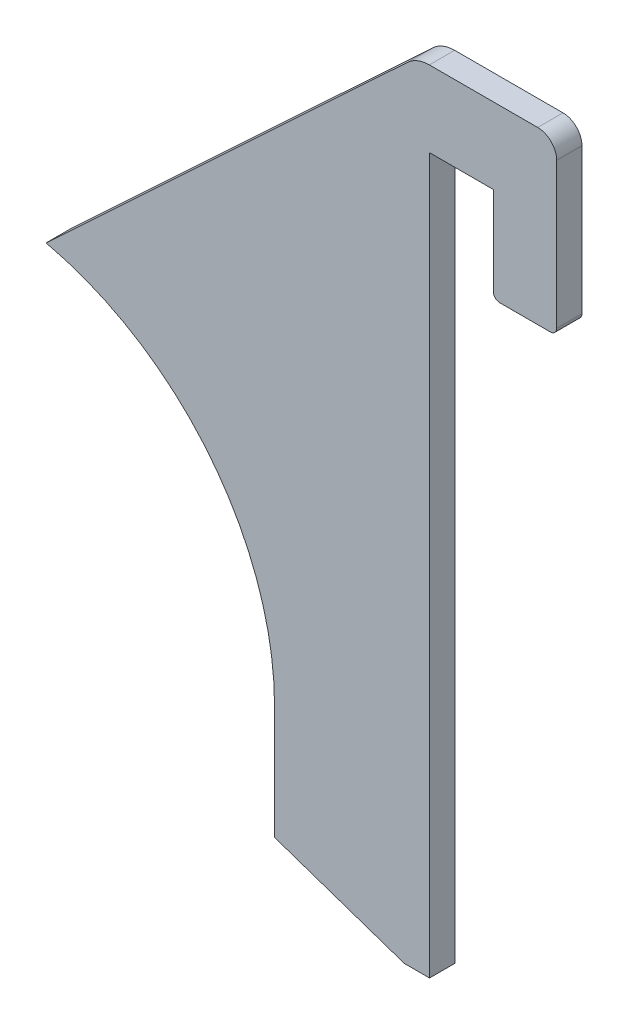
ISO-10303-21;
HEADER;
FILE_DESCRIPTION(('STEP AP214'),'2;1');
FILE_NAME('part.step','',(''),(''),'','','');
FILE_SCHEMA(('AUTOMOTIVE_DESIGN { 1 0 10303 214 1 1 1 1 }'));
ENDSEC;
DATA;
#1=APPLICATION_CONTEXT('core data for automotive mechanical design processes');
#2=APPLICATION_PROTOCOL_DEFINITION('international standard','automotive_design',2000,#1);
#3=PRODUCT_CONTEXT('',#1,'mechanical');
#4=PRODUCT('Part','Part','',(#3));
#5=PRODUCT_RELATED_PRODUCT_CATEGORY('part','',(#4));
#6=PRODUCT_DEFINITION_FORMATION('','',#4);
#7=PRODUCT_DEFINITION_CONTEXT('part definition',#1,'design');
#8=PRODUCT_DEFINITION('design','',#6,#7);
#9=PRODUCT_DEFINITION_SHAPE('','',#8);
#10=(LENGTH_UNIT() NAMED_UNIT(*) SI_UNIT(.MILLI.,.METRE.));
#11=(NAMED_UNIT(*) PLANE_ANGLE_UNIT() SI_UNIT($,.RADIAN.));
#12=(NAMED_UNIT(*) SI_UNIT($,.STERADIAN.) SOLID_ANGLE_UNIT());
#13=UNCERTAINTY_MEASURE_WITH_UNIT(LENGTH_MEASURE(1.E-05),#10,'distance_accuracy_value','');
#14=(GEOMETRIC_REPRESENTATION_CONTEXT(3) GLOBAL_UNCERTAINTY_ASSIGNED_CONTEXT((#13)) GLOBAL_UNIT_ASSIGNED_CONTEXT((#10,
#11,#12)) REPRESENTATION_CONTEXT('',''));
#15=CARTESIAN_POINT('',(0.,0.,0.));
#16=DIRECTION('',(0.,0.,1.));
#17=DIRECTION('',(1.,0.,0.));
#18=AXIS2_PLACEMENT_3D('',#15,#16,#17);
#19=CARTESIAN_POINT('',(69.,100.,4.));
#20=DIRECTION('',(0.681998360062503,-0.731353701619167,0.));
#21=DIRECTION('',(0.731353701619167,0.681998360062503,0.));
#22=AXIS2_PLACEMENT_3D('',#19,#20,#21);
#23=PLANE('',#22);
#24=DIRECTION('',(-0.731353701619166,-0.681998360062503,0.));
#25=VECTOR('',#24,1.);
#26=CARTESIAN_POINT('',(69.,100.,4.));
#27=LINE('',#26,#25);
#28=CARTESIAN_POINT('',(67.5595605777622,98.6567685080958,4.));
#29=VERTEX_POINT('',#28);
#30=CARTESIAN_POINT('',(10.3719829262458,45.3284896083872,4.));
#31=VERTEX_POINT('',#30);
#32=EDGE_CURVE('E143',#29,#31,#27,.T.);
#33=ORIENTED_EDGE('',*,*,#32,.F.);
#34=DIRECTION('',(0.,0.,-1.));
#35=VECTOR('',#34,1.);
#36=CARTESIAN_POINT('',(67.5595605777622,98.6567685080958,4.));
#37=LINE('',#36,#35);
#38=CARTESIAN_POINT('',(67.5595605777622,98.6567685080958,0.));
#39=VERTEX_POINT('',#38);
#40=EDGE_CURVE('E12',#29,#39,#37,.T.);
#41=ORIENTED_EDGE('',*,*,#40,.T.);
#42=DIRECTION('',(-0.731353701619166,-0.681998360062503,0.));
#43=VECTOR('',#42,1.);
#44=CARTESIAN_POINT('',(69.,100.,0.));
#45=LINE('',#44,#43);
#46=CARTESIAN_POINT('',(10.3719829262458,45.3284896083872,0.));
#47=VERTEX_POINT('',#46);
#48=EDGE_CURVE('E166',#39,#47,#45,.T.);
#49=ORIENTED_EDGE('',*,*,#48,.T.);
#50=DIRECTION('',(0.,0.,-1.));
#51=VECTOR('',#50,1.);
#52=CARTESIAN_POINT('',(10.3719829262458,45.3284896083872,4.));
#53=LINE('',#52,#51);
#54=EDGE_CURVE('E159',#31,#47,#53,.T.);
#55=ORIENTED_EDGE('',*,*,#54,.F.);
#56=EDGE_LOOP('',(#33,#41,#49,#55));
#57=FACE_BOUND('',#56,.T.);
#58=ADVANCED_FACE('F36',(#57),#23,.F.);
#59=CARTESIAN_POINT('',(0.,0.,4.));
#60=DIRECTION('',(0.,0.,-1.));
#61=DIRECTION('',(-1.,0.,0.));
#62=AXIS2_PLACEMENT_3D('',#59,#60,#61);
#63=CYLINDRICAL_SURFACE('',#62,46.5);
#64=CARTESIAN_POINT('',(0.,0.,0.));
#65=DIRECTION('',(0.,0.,-1.));
#66=DIRECTION('',(-1.,0.,0.));
#67=AXIS2_PLACEMENT_3D('',#64,#65,#66);
#68=CIRCLE('',#67,46.5);
#69=CARTESIAN_POINT('',(46.5,0.,0.));
#70=VERTEX_POINT('',#69);
#71=EDGE_CURVE('E240',#47,#70,#68,.T.);
#72=ORIENTED_EDGE('',*,*,#71,.T.);
#73=DIRECTION('',(0.,0.,-1.));
#74=VECTOR('',#73,1.);
#75=CARTESIAN_POINT('',(46.5,0.,4.));
#76=LINE('',#75,#74);
#77=CARTESIAN_POINT('',(46.5,0.,4.));
#78=VERTEX_POINT('',#77);
#79=EDGE_CURVE('E161',#78,#70,#76,.T.);
#80=ORIENTED_EDGE('',*,*,#79,.F.);
#81=CARTESIAN_POINT('',(0.,0.,4.));
#82=DIRECTION('',(0.,0.,-1.));
#83=DIRECTION('',(-1.,0.,0.));
#84=AXIS2_PLACEMENT_3D('',#81,#82,#83);
#85=CIRCLE('',#84,46.5);
#86=EDGE_CURVE('E147',#31,#78,#85,.T.);
#87=ORIENTED_EDGE('',*,*,#86,.F.);
#88=ORIENTED_EDGE('',*,*,#54,.T.);
#89=EDGE_LOOP('',(#72,#80,#87,#88));
#90=FACE_BOUND('',#89,.T.);
#91=ADVANCED_FACE('F158',(#90),#63,.F.);
#92=CARTESIAN_POINT('',(46.5,0.,4.));
#93=DIRECTION('',(1.,0.,0.));
#94=DIRECTION('',(0.,1.,0.));
#95=AXIS2_PLACEMENT_3D('',#92,#93,#94);
#96=PLANE('',#95);
#97=DIRECTION('',(0.,-1.,0.));
#98=VECTOR('',#97,1.);
#99=CARTESIAN_POINT('',(46.5,0.,0.));
#100=LINE('',#99,#98);
#101=CARTESIAN_POINT('',(46.5,-18.,0.));
#102=VERTEX_POINT('',#101);
#103=EDGE_CURVE('E238',#70,#102,#100,.T.);
#104=ORIENTED_EDGE('',*,*,#103,.T.);
#105=DIRECTION('',(0.,0.,-1.));
#106=VECTOR('',#105,1.);
#107=CARTESIAN_POINT('',(46.5,-18.,4.));
#108=LINE('',#107,#106);
#109=CARTESIAN_POINT('',(46.5,-18.,4.));
#110=VERTEX_POINT('',#109);
#111=EDGE_CURVE('E172',#110,#102,#108,.T.);
#112=ORIENTED_EDGE('',*,*,#111,.F.);
#113=DIRECTION('',(0.,-1.,0.));
#114=VECTOR('',#113,1.);
#115=CARTESIAN_POINT('',(46.5,0.,4.));
#116=LINE('',#115,#114);
#117=EDGE_CURVE('E163',#78,#110,#116,.T.);
#118=ORIENTED_EDGE('',*,*,#117,.F.);
#119=ORIENTED_EDGE('',*,*,#79,.T.);
#120=EDGE_LOOP('',(#104,#112,#118,#119));
#121=FACE_BOUND('',#120,.T.);
#122=ADVANCED_FACE('F239',(#121),#96,.F.);
#123=CARTESIAN_POINT('',(67.,-25.,4.));
#124=DIRECTION('',(-0.323143853291512,-0.946349856067994,0.));
#125=DIRECTION('',(0.946349856067995,-0.323143853291512,0.));
#126=AXIS2_PLACEMENT_3D('',#123,#124,#125);
#127=PLANE('',#126);
#128=DIRECTION('',(-0.946349856067994,0.323143853291512,0.));
#129=VECTOR('',#128,1.);
#130=CARTESIAN_POINT('',(67.,-25.,0.));
#131=LINE('',#130,#129);
#132=CARTESIAN_POINT('',(67.,-25.,0.));
#133=VERTEX_POINT('',#132);
#134=EDGE_CURVE('E233',#133,#102,#131,.T.);
#135=ORIENTED_EDGE('',*,*,#134,.F.);
#136=DIRECTION('',(0.,0.,-1.));
#137=VECTOR('',#136,1.);
#138=CARTESIAN_POINT('',(67.,-25.,4.));
#139=LINE('',#138,#137);
#140=CARTESIAN_POINT('',(67.,-25.,4.));
#141=VERTEX_POINT('',#140);
#142=EDGE_CURVE('E225',#141,#133,#139,.T.);
#143=ORIENTED_EDGE('',*,*,#142,.F.);
#144=DIRECTION('',(-0.946349856067994,0.323143853291512,0.));
#145=VECTOR('',#144,1.);
#146=CARTESIAN_POINT('',(67.,-25.,4.));
#147=LINE('',#146,#145);
#148=EDGE_CURVE('E235',#141,#110,#147,.T.);
#149=ORIENTED_EDGE('',*,*,#148,.T.);
#150=ORIENTED_EDGE('',*,*,#111,.T.);
#151=EDGE_LOOP('',(#135,#143,#149,#150));
#152=FACE_BOUND('',#151,.T.);
#153=ADVANCED_FACE('F231',(#152),#127,.T.);
#154=CARTESIAN_POINT('',(67.,-25.,4.));
#155=DIRECTION('',(0.,1.,0.));
#156=DIRECTION('',(-1.,0.,0.));
#157=AXIS2_PLACEMENT_3D('',#154,#155,#156);
#158=PLANE('',#157);
#159=DIRECTION('',(1.,0.,0.));
#160=VECTOR('',#159,1.);
#161=CARTESIAN_POINT('',(67.,-25.,0.));
#162=LINE('',#161,#160);
#163=CARTESIAN_POINT('',(71.,-25.,0.));
#164=VERTEX_POINT('',#163);
#165=EDGE_CURVE('E244',#133,#164,#162,.T.);
#166=ORIENTED_EDGE('',*,*,#165,.T.);
#167=DIRECTION('',(0.,0.,-1.));
#168=VECTOR('',#167,1.);
#169=CARTESIAN_POINT('',(71.,-25.,4.));
#170=LINE('',#169,#168);
#171=CARTESIAN_POINT('',(71.,-25.,4.));
#172=VERTEX_POINT('',#171);
#173=EDGE_CURVE('E222',#172,#164,#170,.T.);
#174=ORIENTED_EDGE('',*,*,#173,.F.);
#175=DIRECTION('',(1.,0.,0.));
#176=VECTOR('',#175,1.);
#177=CARTESIAN_POINT('',(67.,-25.,4.));
#178=LINE('',#177,#176);
#179=EDGE_CURVE('E283',#141,#172,#178,.T.);
#180=ORIENTED_EDGE('',*,*,#179,.F.);
#181=ORIENTED_EDGE('',*,*,#142,.T.);
#182=EDGE_LOOP('',(#166,#174,#180,#181));
#183=FACE_BOUND('',#182,.T.);
#184=ADVANCED_FACE('F291',(#183),#158,.F.);
#185=CARTESIAN_POINT('',(71.,-25.,4.));
#186=DIRECTION('',(-1.,0.,0.));
#187=DIRECTION('',(0.,0.,1.));
#188=AXIS2_PLACEMENT_3D('',#185,#186,#187);
#189=PLANE('',#188);
#190=DIRECTION('',(0.,1.,0.));
#191=VECTOR('',#190,1.);
#192=CARTESIAN_POINT('',(71.,-25.,0.));
#193=LINE('',#192,#191);
#194=CARTESIAN_POINT('',(71.,88.,0.));
#195=VERTEX_POINT('',#194);
#196=EDGE_CURVE('E246',#164,#195,#193,.T.);
#197=ORIENTED_EDGE('',*,*,#196,.T.);
#198=DIRECTION('',(0.,0.,-1.));
#199=VECTOR('',#198,1.);
#200=CARTESIAN_POINT('',(71.,88.,4.));
#201=LINE('',#200,#199);
#202=CARTESIAN_POINT('',(71.,88.,4.));
#203=VERTEX_POINT('',#202);
#204=EDGE_CURVE('E219',#203,#195,#201,.T.);
#205=ORIENTED_EDGE('',*,*,#204,.F.);
#206=DIRECTION('',(0.,1.,0.));
#207=VECTOR('',#206,1.);
#208=CARTESIAN_POINT('',(71.,-25.,4.));
#209=LINE('',#208,#207);
#210=EDGE_CURVE('E281',#172,#203,#209,.T.);
#211=ORIENTED_EDGE('',*,*,#210,.F.);
#212=ORIENTED_EDGE('',*,*,#173,.T.);
#213=EDGE_LOOP('',(#197,#205,#211,#212));
#214=FACE_BOUND('',#213,.T.);
#215=ADVANCED_FACE('F293',(#214),#189,.F.);
#216=CARTESIAN_POINT('',(71.,88.,4.));
#217=DIRECTION('',(0.,1.,0.));
#218=DIRECTION('',(0.,0.,1.));
#219=AXIS2_PLACEMENT_3D('',#216,#217,#218);
#220=PLANE('',#219);
#221=DIRECTION('',(1.,0.,0.));
#222=VECTOR('',#221,1.);
#223=CARTESIAN_POINT('',(71.,88.,0.));
#224=LINE('',#223,#222);
#225=CARTESIAN_POINT('',(81.1,88.,0.));
#226=VERTEX_POINT('',#225);
#227=EDGE_CURVE('E251',#195,#226,#224,.T.);
#228=ORIENTED_EDGE('',*,*,#227,.T.);
#229=DIRECTION('',(0.,0.,-1.));
#230=VECTOR('',#229,1.);
#231=CARTESIAN_POINT('',(81.1,88.,4.));
#232=LINE('',#231,#230);
#233=CARTESIAN_POINT('',(81.1,88.,4.));
#234=VERTEX_POINT('',#233);
#235=EDGE_CURVE('E216',#234,#226,#232,.T.);
#236=ORIENTED_EDGE('',*,*,#235,.F.);
#237=DIRECTION('',(1.,0.,0.));
#238=VECTOR('',#237,1.);
#239=CARTESIAN_POINT('',(71.,88.,4.));
#240=LINE('',#239,#238);
#241=EDGE_CURVE('E279',#203,#234,#240,.T.);
#242=ORIENTED_EDGE('',*,*,#241,.F.);
#243=ORIENTED_EDGE('',*,*,#204,.T.);
#244=EDGE_LOOP('',(#228,#236,#242,#243));
#245=FACE_BOUND('',#244,.T.);
#246=ADVANCED_FACE('F298',(#245),#220,.F.);
#247=CARTESIAN_POINT('',(81.1,88.,4.));
#248=DIRECTION('',(1.,0.,0.));
#249=DIRECTION('',(0.,0.,-1.));
#250=AXIS2_PLACEMENT_3D('',#247,#248,#249);
#251=PLANE('',#250);
#252=DIRECTION('',(0.,-1.,0.));
#253=VECTOR('',#252,1.);
#254=CARTESIAN_POINT('',(81.1,88.,0.));
#255=LINE('',#254,#253);
#256=CARTESIAN_POINT('',(81.1,74.,0.));
#257=VERTEX_POINT('',#256);
#258=EDGE_CURVE('E253',#226,#257,#255,.T.);
#259=ORIENTED_EDGE('',*,*,#258,.T.);
#260=DIRECTION('',(0.,0.,-1.));
#261=VECTOR('',#260,1.);
#262=CARTESIAN_POINT('',(81.1,74.,4.));
#263=LINE('',#262,#261);
#264=CARTESIAN_POINT('',(81.1,74.,4.));
#265=VERTEX_POINT('',#264);
#266=EDGE_CURVE('E186',#257,#265,#263,.F.);
#267=ORIENTED_EDGE('',*,*,#266,.T.);
#268=DIRECTION('',(0.,-1.,0.));
#269=VECTOR('',#268,1.);
#270=CARTESIAN_POINT('',(81.1,88.,4.));
#271=LINE('',#270,#269);
#272=EDGE_CURVE('E274',#234,#265,#271,.T.);
#273=ORIENTED_EDGE('',*,*,#272,.F.);
#274=ORIENTED_EDGE('',*,*,#235,.T.);
#275=EDGE_LOOP('',(#259,#267,#273,#274));
#276=FACE_BOUND('',#275,.T.);
#277=ADVANCED_FACE('F306',(#276),#251,.F.);
#278=CARTESIAN_POINT('',(81.1,73.,4.));
#279=DIRECTION('',(0.,1.,0.));
#280=DIRECTION('',(-1.,0.,0.));
#281=AXIS2_PLACEMENT_3D('',#278,#279,#280);
#282=PLANE('',#281);
#283=DIRECTION('',(1.,0.,0.));
#284=VECTOR('',#283,1.);
#285=CARTESIAN_POINT('',(81.1,73.,4.));
#286=LINE('',#285,#284);
#287=CARTESIAN_POINT('',(82.1,73.,4.));
#288=VERTEX_POINT('',#287);
#289=CARTESIAN_POINT('',(90.1,73.,4.));
#290=VERTEX_POINT('',#289);
#291=EDGE_CURVE('E268',#288,#290,#286,.T.);
#292=ORIENTED_EDGE('',*,*,#291,.F.);
#293=DIRECTION('',(0.,0.,-1.));
#294=VECTOR('',#293,1.);
#295=CARTESIAN_POINT('',(82.1,73.,4.));
#296=LINE('',#295,#294);
#297=CARTESIAN_POINT('',(82.1,73.,0.));
#298=VERTEX_POINT('',#297);
#299=EDGE_CURVE('E170',#288,#298,#296,.T.);
#300=ORIENTED_EDGE('',*,*,#299,.T.);
#301=DIRECTION('',(1.,0.,0.));
#302=VECTOR('',#301,1.);
#303=CARTESIAN_POINT('',(81.1,73.,0.));
#304=LINE('',#303,#302);
#305=CARTESIAN_POINT('',(90.1,73.,0.));
#306=VERTEX_POINT('',#305);
#307=EDGE_CURVE('E212',#298,#306,#304,.T.);
#308=ORIENTED_EDGE('',*,*,#307,.T.);
#309=DIRECTION('',(0.,0.,-1.));
#310=VECTOR('',#309,1.);
#311=CARTESIAN_POINT('',(90.1,73.,4.));
#312=LINE('',#311,#310);
#313=EDGE_CURVE('E168',#306,#290,#312,.F.);
#314=ORIENTED_EDGE('',*,*,#313,.T.);
#315=EDGE_LOOP('',(#292,#300,#308,#314));
#316=FACE_BOUND('',#315,.T.);
#317=ADVANCED_FACE('F259',(#316),#282,.F.);
#318=CARTESIAN_POINT('',(91.1,73.,4.));
#319=DIRECTION('',(-1.,0.,0.));
#320=DIRECTION('',(0.,0.,1.));
#321=AXIS2_PLACEMENT_3D('',#318,#319,#320);
#322=PLANE('',#321);
#323=DIRECTION('',(0.,1.,0.));
#324=VECTOR('',#323,1.);
#325=CARTESIAN_POINT('',(91.1,73.,4.));
#326=LINE('',#325,#324);
#327=CARTESIAN_POINT('',(91.1,74.,4.));
#328=VERTEX_POINT('',#327);
#329=CARTESIAN_POINT('',(91.1,97.,4.));
#330=VERTEX_POINT('',#329);
#331=EDGE_CURVE('E267',#328,#330,#326,.T.);
#332=ORIENTED_EDGE('',*,*,#331,.F.);
#333=DIRECTION('',(0.,0.,-1.));
#334=VECTOR('',#333,1.);
#335=CARTESIAN_POINT('',(91.1,74.,4.));
#336=LINE('',#335,#334);
#337=CARTESIAN_POINT('',(91.1,74.,0.));
#338=VERTEX_POINT('',#337);
#339=EDGE_CURVE('E196',#328,#338,#336,.T.);
#340=ORIENTED_EDGE('',*,*,#339,.T.);
#341=DIRECTION('',(0.,1.,0.));
#342=VECTOR('',#341,1.);
#343=CARTESIAN_POINT('',(91.1,73.,0.));
#344=LINE('',#343,#342);
#345=CARTESIAN_POINT('',(91.1,97.,0.));
#346=VERTEX_POINT('',#345);
#347=EDGE_CURVE('E210',#338,#346,#344,.T.);
#348=ORIENTED_EDGE('',*,*,#347,.T.);
#349=DIRECTION('',(0.,0.,-1.));
#350=VECTOR('',#349,1.);
#351=CARTESIAN_POINT('',(91.1,97.,4.));
#352=LINE('',#351,#350);
#353=EDGE_CURVE('E194',#346,#330,#352,.F.);
#354=ORIENTED_EDGE('',*,*,#353,.T.);
#355=EDGE_LOOP('',(#332,#340,#348,#354));
#356=FACE_BOUND('',#355,.T.);
#357=ADVANCED_FACE('F270',(#356),#322,.F.);
#358=CARTESIAN_POINT('',(91.1,100.,4.));
#359=DIRECTION('',(0.,-1.,0.));
#360=DIRECTION('',(1.,0.,0.));
#361=AXIS2_PLACEMENT_3D('',#358,#359,#360);
#362=PLANE('',#361);
#363=DIRECTION('',(-1.,0.,0.));
#364=VECTOR('',#363,1.);
#365=CARTESIAN_POINT('',(91.1,100.,4.));
#366=LINE('',#365,#364);
#367=CARTESIAN_POINT('',(88.1,100.,4.));
#368=VERTEX_POINT('',#367);
#369=CARTESIAN_POINT('',(70.9695523780747,100.,4.));
#370=VERTEX_POINT('',#369);
#371=EDGE_CURVE('E203',#368,#370,#366,.T.);
#372=ORIENTED_EDGE('',*,*,#371,.F.);
#373=DIRECTION('',(0.,0.,-1.));
#374=VECTOR('',#373,1.);
#375=CARTESIAN_POINT('',(88.1,100.,4.));
#376=LINE('',#375,#374);
#377=CARTESIAN_POINT('',(88.1,100.,0.));
#378=VERTEX_POINT('',#377);
#379=EDGE_CURVE('E44',#368,#378,#376,.T.);
#380=ORIENTED_EDGE('',*,*,#379,.T.);
#381=DIRECTION('',(-1.,0.,0.));
#382=VECTOR('',#381,1.);
#383=CARTESIAN_POINT('',(91.1,100.,0.));
#384=LINE('',#383,#382);
#385=CARTESIAN_POINT('',(70.9695523780747,100.,0.));
#386=VERTEX_POINT('',#385);
#387=EDGE_CURVE('E154',#378,#386,#384,.T.);
#388=ORIENTED_EDGE('',*,*,#387,.T.);
#389=DIRECTION('',(0.,0.,-1.));
#390=VECTOR('',#389,1.);
#391=CARTESIAN_POINT('',(70.9695523780747,100.,4.));
#392=LINE('',#391,#390);
#393=EDGE_CURVE('E51',#386,#370,#392,.F.);
#394=ORIENTED_EDGE('',*,*,#393,.T.);
#395=EDGE_LOOP('',(#372,#380,#388,#394));
#396=FACE_BOUND('',#395,.T.);
#397=ADVANCED_FACE('F202',(#396),#362,.F.);
#398=CARTESIAN_POINT('',(0.,0.,4.));
#399=DIRECTION('',(0.,0.,-1.));
#400=DIRECTION('',(-1.,0.,0.));
#401=AXIS2_PLACEMENT_3D('',#398,#399,#400);
#402=PLANE('',#401);
#403=ORIENTED_EDGE('',*,*,#272,.T.);
#404=CARTESIAN_POINT('',(82.1,74.,4.));
#405=DIRECTION('',(0.,0.,-1.));
#406=DIRECTION('',(-1.,0.,0.));
#407=AXIS2_PLACEMENT_3D('',#404,#405,#406);
#408=CIRCLE('',#407,1.);
#409=EDGE_CURVE('E192',#265,#288,#408,.F.);
#410=ORIENTED_EDGE('',*,*,#409,.T.);
#411=ORIENTED_EDGE('',*,*,#291,.T.);
#412=CARTESIAN_POINT('',(90.1,74.,4.));
#413=DIRECTION('',(0.,0.,-1.));
#414=DIRECTION('',(-1.,0.,0.));
#415=AXIS2_PLACEMENT_3D('',#412,#413,#414);
#416=CIRCLE('',#415,1.);
#417=EDGE_CURVE('E190',#290,#328,#416,.F.);
#418=ORIENTED_EDGE('',*,*,#417,.T.);
#419=ORIENTED_EDGE('',*,*,#331,.T.);
#420=CARTESIAN_POINT('',(88.1,97.,4.));
#421=DIRECTION('',(0.,0.,-1.));
#422=DIRECTION('',(-1.,0.,0.));
#423=AXIS2_PLACEMENT_3D('',#420,#421,#422);
#424=CIRCLE('',#423,3.);
#425=EDGE_CURVE('E58',#330,#368,#424,.F.);
#426=ORIENTED_EDGE('',*,*,#425,.T.);
#427=ORIENTED_EDGE('',*,*,#371,.T.);
#428=CARTESIAN_POINT('',(70.9695523780747,95.,4.));
#429=DIRECTION('',(0.,0.,-1.));
#430=DIRECTION('',(-1.,0.,0.));
#431=AXIS2_PLACEMENT_3D('',#428,#429,#430);
#432=CIRCLE('',#431,5.);
#433=EDGE_CURVE('E150',#370,#29,#432,.F.);
#434=ORIENTED_EDGE('',*,*,#433,.T.);
#435=ORIENTED_EDGE('',*,*,#32,.T.);
#436=ORIENTED_EDGE('',*,*,#86,.T.);
#437=ORIENTED_EDGE('',*,*,#117,.T.);
#438=ORIENTED_EDGE('',*,*,#148,.F.);
#439=ORIENTED_EDGE('',*,*,#179,.T.);
#440=ORIENTED_EDGE('',*,*,#210,.T.);
#441=ORIENTED_EDGE('',*,*,#241,.T.);
#442=EDGE_LOOP('',(#403,#410,#411,#418,#419,#426,#427,#434,#435,#436,#437,#438,#439,#440,#441));
#443=FACE_BOUND('',#442,.T.);
#444=ADVANCED_FACE('F146',(#443),#402,.F.);
#445=CARTESIAN_POINT('',(0.,0.,0.));
#446=DIRECTION('',(0.,0.,-1.));
#447=DIRECTION('',(-1.,0.,0.));
#448=AXIS2_PLACEMENT_3D('',#445,#446,#447);
#449=PLANE('',#448);
#450=ORIENTED_EDGE('',*,*,#307,.F.);
#451=CARTESIAN_POINT('',(82.1,74.,0.));
#452=DIRECTION('',(0.,0.,-1.));
#453=DIRECTION('',(-1.,0.,0.));
#454=AXIS2_PLACEMENT_3D('',#451,#452,#453);
#455=CIRCLE('',#454,1.);
#456=EDGE_CURVE('E184',#298,#257,#455,.T.);
#457=ORIENTED_EDGE('',*,*,#456,.T.);
#458=ORIENTED_EDGE('',*,*,#258,.F.);
#459=ORIENTED_EDGE('',*,*,#227,.F.);
#460=ORIENTED_EDGE('',*,*,#196,.F.);
#461=ORIENTED_EDGE('',*,*,#165,.F.);
#462=ORIENTED_EDGE('',*,*,#134,.T.);
#463=ORIENTED_EDGE('',*,*,#103,.F.);
#464=ORIENTED_EDGE('',*,*,#71,.F.);
#465=ORIENTED_EDGE('',*,*,#48,.F.);
#466=CARTESIAN_POINT('',(70.9695523780747,95.,0.));
#467=DIRECTION('',(0.,0.,-1.));
#468=DIRECTION('',(-1.,0.,0.));
#469=AXIS2_PLACEMENT_3D('',#466,#467,#468);
#470=CIRCLE('',#469,5.);
#471=EDGE_CURVE('E178',#39,#386,#470,.T.);
#472=ORIENTED_EDGE('',*,*,#471,.T.);
#473=ORIENTED_EDGE('',*,*,#387,.F.);
#474=CARTESIAN_POINT('',(88.1,97.,0.));
#475=DIRECTION('',(0.,0.,-1.));
#476=DIRECTION('',(-1.,0.,0.));
#477=AXIS2_PLACEMENT_3D('',#474,#475,#476);
#478=CIRCLE('',#477,3.);
#479=EDGE_CURVE('E180',#378,#346,#478,.T.);
#480=ORIENTED_EDGE('',*,*,#479,.T.);
#481=ORIENTED_EDGE('',*,*,#347,.F.);
#482=CARTESIAN_POINT('',(90.1,74.,0.));
#483=DIRECTION('',(0.,0.,-1.));
#484=DIRECTION('',(-1.,0.,0.));
#485=AXIS2_PLACEMENT_3D('',#482,#483,#484);
#486=CIRCLE('',#485,1.);
#487=EDGE_CURVE('E182',#338,#306,#486,.T.);
#488=ORIENTED_EDGE('',*,*,#487,.T.);
#489=EDGE_LOOP('',(#450,#457,#458,#459,#460,#461,#462,#463,#464,#465,#472,#473,#480,#481,#488));
#490=FACE_BOUND('',#489,.T.);
#491=ADVANCED_FACE('F207',(#490),#449,.T.);
#492=CARTESIAN_POINT('',(82.1,74.,4.));
#493=DIRECTION('',(0.,0.,-1.));
#494=DIRECTION('',(-1.,0.,0.));
#495=AXIS2_PLACEMENT_3D('',#492,#493,#494);
#496=CYLINDRICAL_SURFACE('',#495,1.);
#497=ORIENTED_EDGE('',*,*,#409,.F.);
#498=ORIENTED_EDGE('',*,*,#266,.F.);
#499=ORIENTED_EDGE('',*,*,#456,.F.);
#500=ORIENTED_EDGE('',*,*,#299,.F.);
#501=EDGE_LOOP('',(#497,#498,#499,#500));
#502=FACE_BOUND('',#501,.T.);
#503=ADVANCED_FACE('F304',(#502),#496,.T.);
#504=CARTESIAN_POINT('',(90.1,74.,4.));
#505=DIRECTION('',(0.,0.,-1.));
#506=DIRECTION('',(-1.,0.,0.));
#507=AXIS2_PLACEMENT_3D('',#504,#505,#506);
#508=CYLINDRICAL_SURFACE('',#507,1.);
#509=ORIENTED_EDGE('',*,*,#417,.F.);
#510=ORIENTED_EDGE('',*,*,#313,.F.);
#511=ORIENTED_EDGE('',*,*,#487,.F.);
#512=ORIENTED_EDGE('',*,*,#339,.F.);
#513=EDGE_LOOP('',(#509,#510,#511,#512));
#514=FACE_BOUND('',#513,.T.);
#515=ADVANCED_FACE('F264',(#514),#508,.T.);
#516=CARTESIAN_POINT('',(88.1,97.,4.));
#517=DIRECTION('',(0.,0.,-1.));
#518=DIRECTION('',(-1.,0.,0.));
#519=AXIS2_PLACEMENT_3D('',#516,#517,#518);
#520=CYLINDRICAL_SURFACE('',#519,3.);
#521=ORIENTED_EDGE('',*,*,#425,.F.);
#522=ORIENTED_EDGE('',*,*,#353,.F.);
#523=ORIENTED_EDGE('',*,*,#479,.F.);
#524=ORIENTED_EDGE('',*,*,#379,.F.);
#525=EDGE_LOOP('',(#521,#522,#523,#524));
#526=FACE_BOUND('',#525,.T.);
#527=ADVANCED_FACE('F326',(#526),#520,.T.);
#528=CARTESIAN_POINT('',(70.9695523780747,95.,4.));
#529=DIRECTION('',(0.,0.,-1.));
#530=DIRECTION('',(-1.,0.,0.));
#531=AXIS2_PLACEMENT_3D('',#528,#529,#530);
#532=CYLINDRICAL_SURFACE('',#531,5.);
#533=ORIENTED_EDGE('',*,*,#433,.F.);
#534=ORIENTED_EDGE('',*,*,#393,.F.);
#535=ORIENTED_EDGE('',*,*,#471,.F.);
#536=ORIENTED_EDGE('',*,*,#40,.F.);
#537=EDGE_LOOP('',(#533,#534,#535,#536));
#538=FACE_BOUND('',#537,.T.);
#539=ADVANCED_FACE('F38',(#538),#532,.T.);
#540=CLOSED_SHELL('',(#58,#91,#122,#153,#184,#215,#246,#277,#317,#357,#397,#444,#491,#503,#515,
#527,#539));
#541=MANIFOLD_SOLID_BREP('B2',#540);
#542=ADVANCED_BREP_SHAPE_REPRESENTATION('',(#18,#541),#14);
#543=SHAPE_DEFINITION_REPRESENTATION(#9,#542);
ENDSEC;
END-ISO-10303-21;
